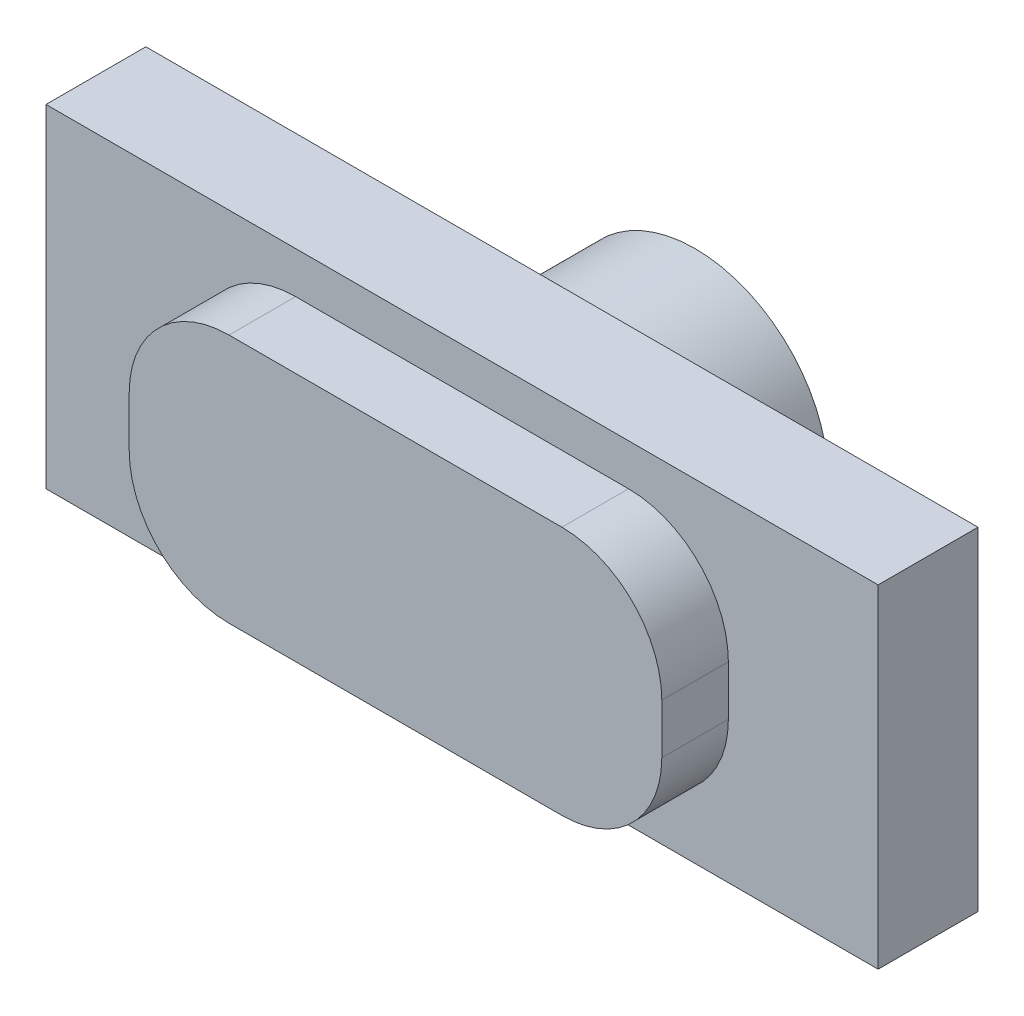
ISO-10303-21;
HEADER;
FILE_DESCRIPTION(('STEP AP214'),'2;1');
FILE_NAME('part.step','',(''),(''),'','','');
FILE_SCHEMA(('AUTOMOTIVE_DESIGN { 1 0 10303 214 1 1 1 1 }'));
ENDSEC;
DATA;
#1=APPLICATION_CONTEXT('core data for automotive mechanical design processes');
#2=APPLICATION_PROTOCOL_DEFINITION('international standard','automotive_design',2000,#1);
#3=PRODUCT_CONTEXT('',#1,'mechanical');
#4=PRODUCT('Part','Part','',(#3));
#5=PRODUCT_RELATED_PRODUCT_CATEGORY('part','',(#4));
#6=PRODUCT_DEFINITION_FORMATION('','',#4);
#7=PRODUCT_DEFINITION_CONTEXT('part definition',#1,'design');
#8=PRODUCT_DEFINITION('design','',#6,#7);
#9=PRODUCT_DEFINITION_SHAPE('','',#8);
#10=(LENGTH_UNIT() NAMED_UNIT(*) SI_UNIT(.MILLI.,.METRE.));
#11=(NAMED_UNIT(*) PLANE_ANGLE_UNIT() SI_UNIT($,.RADIAN.));
#12=(NAMED_UNIT(*) SI_UNIT($,.STERADIAN.) SOLID_ANGLE_UNIT());
#13=UNCERTAINTY_MEASURE_WITH_UNIT(LENGTH_MEASURE(1.E-05),#10,'distance_accuracy_value','');
#14=(GEOMETRIC_REPRESENTATION_CONTEXT(3) GLOBAL_UNCERTAINTY_ASSIGNED_CONTEXT((#13)) GLOBAL_UNIT_ASSIGNED_CONTEXT((#10,
#11,#12)) REPRESENTATION_CONTEXT('',''));
#15=CARTESIAN_POINT('',(0.,0.,0.));
#16=DIRECTION('',(0.,0.,1.));
#17=DIRECTION('',(1.,0.,0.));
#18=AXIS2_PLACEMENT_3D('',#15,#16,#17);
#19=CARTESIAN_POINT('',(0.,0.499999999999999,-4.));
#20=DIRECTION('',(0.,-1.,0.));
#21=DIRECTION('',(1.,0.,0.));
#22=AXIS2_PLACEMENT_3D('',#19,#20,#21);
#23=PLANE('',#22);
#24=DIRECTION('',(0.,0.,-1.));
#25=VECTOR('',#24,1.);
#26=CARTESIAN_POINT('',(-2.55147016443461,0.499999999999999,4.7));
#27=LINE('',#26,#25);
#28=CARTESIAN_POINT('',(-2.55147016443461,0.499999999999999,0.));
#29=VERTEX_POINT('',#28);
#30=CARTESIAN_POINT('',(-2.55147016443461,0.499999999999999,-4.));
#31=VERTEX_POINT('',#30);
#32=EDGE_CURVE('E168',#29,#31,#27,.T.);
#33=ORIENTED_EDGE('',*,*,#32,.F.);
#34=DIRECTION('',(1.,0.,0.));
#35=VECTOR('',#34,1.);
#36=CARTESIAN_POINT('',(0.,0.499999999999999,0.));
#37=LINE('',#36,#35);
#38=CARTESIAN_POINT('',(-3.96862696659689,0.499999999999999,0.));
#39=VERTEX_POINT('',#38);
#40=EDGE_CURVE('E202',#39,#29,#37,.T.);
#41=ORIENTED_EDGE('',*,*,#40,.F.);
#42=DIRECTION('',(0.,0.,1.));
#43=VECTOR('',#42,1.);
#44=CARTESIAN_POINT('',(-3.96862696659689,0.499999999999999,-4.));
#45=LINE('',#44,#43);
#46=CARTESIAN_POINT('',(-3.96862696659689,0.499999999999999,-4.));
#47=VERTEX_POINT('',#46);
#48=EDGE_CURVE('E191',#47,#39,#45,.T.);
#49=ORIENTED_EDGE('',*,*,#48,.F.);
#50=DIRECTION('',(1.,0.,0.));
#51=VECTOR('',#50,1.);
#52=CARTESIAN_POINT('',(0.,0.499999999999999,-4.));
#53=LINE('',#52,#51);
#54=EDGE_CURVE('E186',#47,#31,#53,.T.);
#55=ORIENTED_EDGE('',*,*,#54,.T.);
#56=EDGE_LOOP('',(#33,#41,#49,#55));
#57=FACE_BOUND('',#56,.T.);
#58=ADVANCED_FACE('F33',(#57),#23,.T.);
#59=CARTESIAN_POINT('',(0.,-0.499999999999999,-4.));
#60=DIRECTION('',(0.,-1.,0.));
#61=DIRECTION('',(1.,0.,0.));
#62=AXIS2_PLACEMENT_3D('',#59,#60,#61);
#63=PLANE('',#62);
#64=DIRECTION('',(1.,0.,0.));
#65=VECTOR('',#64,1.);
#66=CARTESIAN_POINT('',(0.,-0.499999999999999,0.));
#67=LINE('',#66,#65);
#68=CARTESIAN_POINT('',(-3.96862696659689,-0.499999999999999,0.));
#69=VERTEX_POINT('',#68);
#70=CARTESIAN_POINT('',(-2.55147016443461,-0.499999999999999,0.));
#71=VERTEX_POINT('',#70);
#72=EDGE_CURVE('E405',#69,#71,#67,.T.);
#73=ORIENTED_EDGE('',*,*,#72,.T.);
#74=DIRECTION('',(0.,0.,-1.));
#75=VECTOR('',#74,1.);
#76=CARTESIAN_POINT('',(-2.55147016443461,-0.499999999999999,4.7));
#77=LINE('',#76,#75);
#78=CARTESIAN_POINT('',(-2.55147016443461,-0.499999999999999,-4.));
#79=VERTEX_POINT('',#78);
#80=EDGE_CURVE('E390',#71,#79,#77,.T.);
#81=ORIENTED_EDGE('',*,*,#80,.T.);
#82=DIRECTION('',(1.,0.,0.));
#83=VECTOR('',#82,1.);
#84=CARTESIAN_POINT('',(0.,-0.499999999999999,-4.));
#85=LINE('',#84,#83);
#86=CARTESIAN_POINT('',(-3.96862696659689,-0.499999999999999,-4.));
#87=VERTEX_POINT('',#86);
#88=EDGE_CURVE('E398',#87,#79,#85,.T.);
#89=ORIENTED_EDGE('',*,*,#88,.F.);
#90=DIRECTION('',(0.,0.,1.));
#91=VECTOR('',#90,1.);
#92=CARTESIAN_POINT('',(-3.96862696659689,-0.499999999999999,-4.));
#93=LINE('',#92,#91);
#94=EDGE_CURVE('E404',#87,#69,#93,.T.);
#95=ORIENTED_EDGE('',*,*,#94,.T.);
#96=EDGE_LOOP('',(#73,#81,#89,#95));
#97=FACE_BOUND('',#96,.T.);
#98=ADVANCED_FACE('F368',(#97),#63,.F.);
#99=CARTESIAN_POINT('',(0.,0.,0.));
#100=DIRECTION('',(0.,0.,1.));
#101=DIRECTION('',(1.,0.,0.));
#102=AXIS2_PLACEMENT_3D('',#99,#100,#101);
#103=PLANE('',#102);
#104=ORIENTED_EDGE('',*,*,#40,.T.);
#105=CARTESIAN_POINT('',(0.,0.,0.));
#106=DIRECTION('',(0.,0.,1.));
#107=DIRECTION('',(1.,0.,0.));
#108=AXIS2_PLACEMENT_3D('',#105,#106,#107);
#109=CIRCLE('',#108,2.6);
#110=EDGE_CURVE('E175',#29,#71,#109,.T.);
#111=ORIENTED_EDGE('',*,*,#110,.T.);
#112=ORIENTED_EDGE('',*,*,#72,.F.);
#113=CARTESIAN_POINT('',(0.,0.,0.));
#114=DIRECTION('',(0.,0.,-1.));
#115=DIRECTION('',(-1.,0.,0.));
#116=AXIS2_PLACEMENT_3D('',#113,#114,#115);
#117=CIRCLE('',#116,4.);
#118=CARTESIAN_POINT('',(3.96862696659689,-0.5,0.));
#119=VERTEX_POINT('',#118);
#120=EDGE_CURVE('E408',#119,#69,#117,.T.);
#121=ORIENTED_EDGE('',*,*,#120,.F.);
#122=CARTESIAN_POINT('',(2.55147016443461,-0.5,0.));
#123=VERTEX_POINT('',#122);
#124=EDGE_CURVE('E54',#123,#119,#67,.T.);
#125=ORIENTED_EDGE('',*,*,#124,.F.);
#126=CARTESIAN_POINT('',(2.55147016443461,0.5,0.));
#127=VERTEX_POINT('',#126);
#128=EDGE_CURVE('E391',#123,#127,#109,.T.);
#129=ORIENTED_EDGE('',*,*,#128,.T.);
#130=CARTESIAN_POINT('',(3.96862696659689,0.5,0.));
#131=VERTEX_POINT('',#130);
#132=EDGE_CURVE('E204',#127,#131,#37,.T.);
#133=ORIENTED_EDGE('',*,*,#132,.T.);
#134=CARTESIAN_POINT('',(0.,0.,0.));
#135=DIRECTION('',(0.,0.,-1.));
#136=DIRECTION('',(-1.,0.,0.));
#137=AXIS2_PLACEMENT_3D('',#134,#135,#136);
#138=CIRCLE('',#137,4.);
#139=EDGE_CURVE('E197',#39,#131,#138,.T.);
#140=ORIENTED_EDGE('',*,*,#139,.F.);
#141=EDGE_LOOP('',(#104,#111,#112,#121,#125,#129,#133,#140));
#142=FACE_BOUND('',#141,.T.);
#143=DIRECTION('',(0.,1.,0.));
#144=VECTOR('',#143,1.);
#145=CARTESIAN_POINT('',(12.5,5.,0.));
#146=LINE('',#145,#144);
#147=CARTESIAN_POINT('',(12.5,-5.,0.));
#148=VERTEX_POINT('',#147);
#149=CARTESIAN_POINT('',(12.5,5.,0.));
#150=VERTEX_POINT('',#149);
#151=EDGE_CURVE('E267',#148,#150,#146,.T.);
#152=ORIENTED_EDGE('',*,*,#151,.F.);
#153=DIRECTION('',(1.,0.,0.));
#154=VECTOR('',#153,1.);
#155=CARTESIAN_POINT('',(-12.5,-5.,0.));
#156=LINE('',#155,#154);
#157=CARTESIAN_POINT('',(-12.5,-5.,0.));
#158=VERTEX_POINT('',#157);
#159=EDGE_CURVE('E272',#158,#148,#156,.T.);
#160=ORIENTED_EDGE('',*,*,#159,.F.);
#161=DIRECTION('',(0.,-1.,0.));
#162=VECTOR('',#161,1.);
#163=CARTESIAN_POINT('',(-12.5,5.,0.));
#164=LINE('',#163,#162);
#165=CARTESIAN_POINT('',(-12.5,5.,0.));
#166=VERTEX_POINT('',#165);
#167=EDGE_CURVE('E283',#166,#158,#164,.T.);
#168=ORIENTED_EDGE('',*,*,#167,.F.);
#169=DIRECTION('',(-1.,0.,0.));
#170=VECTOR('',#169,1.);
#171=CARTESIAN_POINT('',(-12.5,5.,0.));
#172=LINE('',#171,#170);
#173=EDGE_CURVE('E281',#150,#166,#172,.T.);
#174=ORIENTED_EDGE('',*,*,#173,.F.);
#175=EDGE_LOOP('',(#152,#160,#168,#174));
#176=FACE_BOUND('',#175,.T.);
#177=ADVANCED_FACE('F304',(#142,#176),#103,.F.);
#178=CARTESIAN_POINT('',(0.,0.,3.));
#179=DIRECTION('',(0.,0.,1.));
#180=DIRECTION('',(1.,0.,0.));
#181=AXIS2_PLACEMENT_3D('',#178,#179,#180);
#182=PLANE('',#181);
#183=DIRECTION('',(0.,1.,0.));
#184=VECTOR('',#183,1.);
#185=CARTESIAN_POINT('',(12.5,5.,3.));
#186=LINE('',#185,#184);
#187=CARTESIAN_POINT('',(12.5,-5.,3.));
#188=VERTEX_POINT('',#187);
#189=CARTESIAN_POINT('',(12.5,5.,3.));
#190=VERTEX_POINT('',#189);
#191=EDGE_CURVE('E268',#188,#190,#186,.T.);
#192=ORIENTED_EDGE('',*,*,#191,.T.);
#193=DIRECTION('',(-1.,0.,0.));
#194=VECTOR('',#193,1.);
#195=CARTESIAN_POINT('',(-12.5,5.,3.));
#196=LINE('',#195,#194);
#197=CARTESIAN_POINT('',(-12.5,5.,3.));
#198=VERTEX_POINT('',#197);
#199=EDGE_CURVE('E271',#190,#198,#196,.T.);
#200=ORIENTED_EDGE('',*,*,#199,.T.);
#201=DIRECTION('',(0.,-1.,0.));
#202=VECTOR('',#201,1.);
#203=CARTESIAN_POINT('',(-12.5,5.,3.));
#204=LINE('',#203,#202);
#205=CARTESIAN_POINT('',(-12.5,-5.,3.));
#206=VERTEX_POINT('',#205);
#207=EDGE_CURVE('E274',#198,#206,#204,.T.);
#208=ORIENTED_EDGE('',*,*,#207,.T.);
#209=DIRECTION('',(1.,0.,0.));
#210=VECTOR('',#209,1.);
#211=CARTESIAN_POINT('',(-12.5,-5.,3.));
#212=LINE('',#211,#210);
#213=EDGE_CURVE('E276',#206,#188,#212,.T.);
#214=ORIENTED_EDGE('',*,*,#213,.T.);
#215=EDGE_LOOP('',(#192,#200,#208,#214));
#216=FACE_BOUND('',#215,.T.);
#217=DIRECTION('',(0.,1.,0.));
#218=VECTOR('',#217,1.);
#219=CARTESIAN_POINT('',(8.,0.74999999999998,3.));
#220=LINE('',#219,#218);
#221=CARTESIAN_POINT('',(8.,-0.749999999999979,3.));
#222=VERTEX_POINT('',#221);
#223=CARTESIAN_POINT('',(8.,0.749999999999981,3.));
#224=VERTEX_POINT('',#223);
#225=EDGE_CURVE('E232',#222,#224,#220,.T.);
#226=ORIENTED_EDGE('',*,*,#225,.F.);
#227=CARTESIAN_POINT('',(5.,-0.75,3.));
#228=DIRECTION('',(0.,0.,1.));
#229=DIRECTION('',(1.,0.,0.));
#230=AXIS2_PLACEMENT_3D('',#227,#228,#229);
#231=CIRCLE('',#230,3.);
#232=CARTESIAN_POINT('',(4.99999999999998,-3.75,3.));
#233=VERTEX_POINT('',#232);
#234=EDGE_CURVE('E210',#233,#222,#231,.T.);
#235=ORIENTED_EDGE('',*,*,#234,.F.);
#236=DIRECTION('',(1.,0.,0.));
#237=VECTOR('',#236,1.);
#238=CARTESIAN_POINT('',(-4.99999999999998,-3.75,3.));
#239=LINE('',#238,#237);
#240=CARTESIAN_POINT('',(-4.99999999999998,-3.75,3.));
#241=VERTEX_POINT('',#240);
#242=EDGE_CURVE('E215',#241,#233,#239,.T.);
#243=ORIENTED_EDGE('',*,*,#242,.F.);
#244=CARTESIAN_POINT('',(-5.,-0.749999999999999,3.));
#245=DIRECTION('',(0.,0.,1.));
#246=DIRECTION('',(1.,0.,0.));
#247=AXIS2_PLACEMENT_3D('',#244,#245,#246);
#248=CIRCLE('',#247,3.);
#249=CARTESIAN_POINT('',(-8.,-0.749999999999979,3.));
#250=VERTEX_POINT('',#249);
#251=EDGE_CURVE('E242',#250,#241,#248,.T.);
#252=ORIENTED_EDGE('',*,*,#251,.F.);
#253=DIRECTION('',(0.,-1.,0.));
#254=VECTOR('',#253,1.);
#255=CARTESIAN_POINT('',(-8.,0.749999999999979,3.));
#256=LINE('',#255,#254);
#257=CARTESIAN_POINT('',(-8.,0.749999999999979,3.));
#258=VERTEX_POINT('',#257);
#259=EDGE_CURVE('E240',#258,#250,#256,.T.);
#260=ORIENTED_EDGE('',*,*,#259,.F.);
#261=CARTESIAN_POINT('',(-5.,0.75,3.));
#262=DIRECTION('',(0.,0.,1.));
#263=DIRECTION('',(1.,0.,0.));
#264=AXIS2_PLACEMENT_3D('',#261,#262,#263);
#265=CIRCLE('',#264,3.);
#266=CARTESIAN_POINT('',(-4.99999999999998,3.75,3.));
#267=VERTEX_POINT('',#266);
#268=EDGE_CURVE('E238',#267,#258,#265,.T.);
#269=ORIENTED_EDGE('',*,*,#268,.F.);
#270=DIRECTION('',(-1.,0.,0.));
#271=VECTOR('',#270,1.);
#272=CARTESIAN_POINT('',(-4.99999999999998,3.75,3.));
#273=LINE('',#272,#271);
#274=CARTESIAN_POINT('',(4.99999999999998,3.75,3.));
#275=VERTEX_POINT('',#274);
#276=EDGE_CURVE('E236',#275,#267,#273,.T.);
#277=ORIENTED_EDGE('',*,*,#276,.F.);
#278=CARTESIAN_POINT('',(5.,0.750000000000001,3.));
#279=DIRECTION('',(0.,0.,1.));
#280=DIRECTION('',(-1.,0.,0.));
#281=AXIS2_PLACEMENT_3D('',#278,#279,#280);
#282=CIRCLE('',#281,3.);
#283=EDGE_CURVE('E234',#224,#275,#282,.T.);
#284=ORIENTED_EDGE('',*,*,#283,.F.);
#285=EDGE_LOOP('',(#226,#235,#243,#252,#260,#269,#277,#284));
#286=FACE_BOUND('',#285,.T.);
#287=ADVANCED_FACE('F314',(#216,#286),#182,.T.);
#288=CARTESIAN_POINT('',(12.5,5.,3.));
#289=DIRECTION('',(-1.,0.,0.));
#290=DIRECTION('',(0.,0.,1.));
#291=AXIS2_PLACEMENT_3D('',#288,#289,#290);
#292=PLANE('',#291);
#293=ORIENTED_EDGE('',*,*,#151,.T.);
#294=DIRECTION('',(0.,0.,-1.));
#295=VECTOR('',#294,1.);
#296=CARTESIAN_POINT('',(12.5,5.,3.));
#297=LINE('',#296,#295);
#298=EDGE_CURVE('E41',#190,#150,#297,.T.);
#299=ORIENTED_EDGE('',*,*,#298,.F.);
#300=ORIENTED_EDGE('',*,*,#191,.F.);
#301=DIRECTION('',(0.,0.,-1.));
#302=VECTOR('',#301,1.);
#303=CARTESIAN_POINT('',(12.5,-5.,3.));
#304=LINE('',#303,#302);
#305=EDGE_CURVE('E278',#188,#148,#304,.T.);
#306=ORIENTED_EDGE('',*,*,#305,.T.);
#307=EDGE_LOOP('',(#293,#299,#300,#306));
#308=FACE_BOUND('',#307,.T.);
#309=ADVANCED_FACE('F35',(#308),#292,.F.);
#310=CARTESIAN_POINT('',(-12.5,5.,3.));
#311=DIRECTION('',(0.,-1.,0.));
#312=DIRECTION('',(0.,0.,-1.));
#313=AXIS2_PLACEMENT_3D('',#310,#311,#312);
#314=PLANE('',#313);
#315=ORIENTED_EDGE('',*,*,#173,.T.);
#316=DIRECTION('',(0.,0.,-1.));
#317=VECTOR('',#316,1.);
#318=CARTESIAN_POINT('',(-12.5,5.,3.));
#319=LINE('',#318,#317);
#320=EDGE_CURVE('E291',#198,#166,#319,.T.);
#321=ORIENTED_EDGE('',*,*,#320,.F.);
#322=ORIENTED_EDGE('',*,*,#199,.F.);
#323=ORIENTED_EDGE('',*,*,#298,.T.);
#324=EDGE_LOOP('',(#315,#321,#322,#323));
#325=FACE_BOUND('',#324,.T.);
#326=ADVANCED_FACE('F296',(#325),#314,.F.);
#327=CARTESIAN_POINT('',(-12.5,5.,3.));
#328=DIRECTION('',(1.,0.,0.));
#329=DIRECTION('',(0.,0.,-1.));
#330=AXIS2_PLACEMENT_3D('',#327,#328,#329);
#331=PLANE('',#330);
#332=ORIENTED_EDGE('',*,*,#167,.T.);
#333=DIRECTION('',(0.,0.,-1.));
#334=VECTOR('',#333,1.);
#335=CARTESIAN_POINT('',(-12.5,-5.,3.));
#336=LINE('',#335,#334);
#337=EDGE_CURVE('E288',#206,#158,#336,.T.);
#338=ORIENTED_EDGE('',*,*,#337,.F.);
#339=ORIENTED_EDGE('',*,*,#207,.F.);
#340=ORIENTED_EDGE('',*,*,#320,.T.);
#341=EDGE_LOOP('',(#332,#338,#339,#340));
#342=FACE_BOUND('',#341,.T.);
#343=ADVANCED_FACE('F308',(#342),#331,.F.);
#344=CARTESIAN_POINT('',(-12.5,-5.,3.));
#345=DIRECTION('',(0.,1.,0.));
#346=DIRECTION('',(0.,0.,1.));
#347=AXIS2_PLACEMENT_3D('',#344,#345,#346);
#348=PLANE('',#347);
#349=ORIENTED_EDGE('',*,*,#159,.T.);
#350=ORIENTED_EDGE('',*,*,#305,.F.);
#351=ORIENTED_EDGE('',*,*,#213,.F.);
#352=ORIENTED_EDGE('',*,*,#337,.T.);
#353=EDGE_LOOP('',(#349,#350,#351,#352));
#354=FACE_BOUND('',#353,.T.);
#355=ADVANCED_FACE('F312',(#354),#348,.F.);
#356=CARTESIAN_POINT('',(5.,-0.75,5.));
#357=DIRECTION('',(0.,0.,-1.));
#358=DIRECTION('',(-1.,0.,0.));
#359=AXIS2_PLACEMENT_3D('',#356,#357,#358);
#360=CYLINDRICAL_SURFACE('',#359,3.);
#361=ORIENTED_EDGE('',*,*,#234,.T.);
#362=DIRECTION('',(0.,0.,-1.));
#363=VECTOR('',#362,1.);
#364=CARTESIAN_POINT('',(8.,-0.749999999999979,5.));
#365=LINE('',#364,#363);
#366=CARTESIAN_POINT('',(8.,-0.749999999999979,5.));
#367=VERTEX_POINT('',#366);
#368=EDGE_CURVE('E265',#367,#222,#365,.T.);
#369=ORIENTED_EDGE('',*,*,#368,.F.);
#370=CARTESIAN_POINT('',(5.,-0.75,5.));
#371=DIRECTION('',(0.,0.,1.));
#372=DIRECTION('',(1.,0.,0.));
#373=AXIS2_PLACEMENT_3D('',#370,#371,#372);
#374=CIRCLE('',#373,3.);
#375=CARTESIAN_POINT('',(4.99999999999998,-3.75,5.));
#376=VERTEX_POINT('',#375);
#377=EDGE_CURVE('E211',#376,#367,#374,.T.);
#378=ORIENTED_EDGE('',*,*,#377,.F.);
#379=DIRECTION('',(0.,0.,-1.));
#380=VECTOR('',#379,1.);
#381=CARTESIAN_POINT('',(4.99999999999998,-3.75,5.));
#382=LINE('',#381,#380);
#383=EDGE_CURVE('E229',#376,#233,#382,.T.);
#384=ORIENTED_EDGE('',*,*,#383,.T.);
#385=EDGE_LOOP('',(#361,#369,#378,#384));
#386=FACE_BOUND('',#385,.T.);
#387=ADVANCED_FACE('F339',(#386),#360,.T.);
#388=CARTESIAN_POINT('',(8.,0.74999999999998,5.));
#389=DIRECTION('',(-1.,0.,0.));
#390=DIRECTION('',(0.,0.,1.));
#391=AXIS2_PLACEMENT_3D('',#388,#389,#390);
#392=PLANE('',#391);
#393=ORIENTED_EDGE('',*,*,#225,.T.);
#394=DIRECTION('',(0.,0.,-1.));
#395=VECTOR('',#394,1.);
#396=CARTESIAN_POINT('',(8.,0.749999999999981,5.));
#397=LINE('',#396,#395);
#398=CARTESIAN_POINT('',(8.,0.749999999999981,5.));
#399=VERTEX_POINT('',#398);
#400=EDGE_CURVE('E262',#399,#224,#397,.T.);
#401=ORIENTED_EDGE('',*,*,#400,.F.);
#402=DIRECTION('',(0.,1.,0.));
#403=VECTOR('',#402,1.);
#404=CARTESIAN_POINT('',(8.,0.74999999999998,5.));
#405=LINE('',#404,#403);
#406=EDGE_CURVE('E214',#367,#399,#405,.T.);
#407=ORIENTED_EDGE('',*,*,#406,.F.);
#408=ORIENTED_EDGE('',*,*,#368,.T.);
#409=EDGE_LOOP('',(#393,#401,#407,#408));
#410=FACE_BOUND('',#409,.T.);
#411=ADVANCED_FACE('F325',(#410),#392,.F.);
#412=CARTESIAN_POINT('',(5.,0.750000000000001,5.));
#413=DIRECTION('',(0.,0.,-1.));
#414=DIRECTION('',(-1.,0.,0.));
#415=AXIS2_PLACEMENT_3D('',#412,#413,#414);
#416=CYLINDRICAL_SURFACE('',#415,3.);
#417=ORIENTED_EDGE('',*,*,#283,.T.);
#418=DIRECTION('',(0.,0.,-1.));
#419=VECTOR('',#418,1.);
#420=CARTESIAN_POINT('',(4.99999999999998,3.75,5.));
#421=LINE('',#420,#419);
#422=CARTESIAN_POINT('',(4.99999999999998,3.75,5.));
#423=VERTEX_POINT('',#422);
#424=EDGE_CURVE('E259',#423,#275,#421,.T.);
#425=ORIENTED_EDGE('',*,*,#424,.F.);
#426=CARTESIAN_POINT('',(5.,0.750000000000001,5.));
#427=DIRECTION('',(0.,0.,1.));
#428=DIRECTION('',(-1.,0.,0.));
#429=AXIS2_PLACEMENT_3D('',#426,#427,#428);
#430=CIRCLE('',#429,3.);
#431=EDGE_CURVE('E217',#399,#423,#430,.T.);
#432=ORIENTED_EDGE('',*,*,#431,.F.);
#433=ORIENTED_EDGE('',*,*,#400,.T.);
#434=EDGE_LOOP('',(#417,#425,#432,#433));
#435=FACE_BOUND('',#434,.T.);
#436=ADVANCED_FACE('F329',(#435),#416,.T.);
#437=CARTESIAN_POINT('',(-4.99999999999998,3.75,5.));
#438=DIRECTION('',(0.,-1.,0.));
#439=DIRECTION('',(0.,0.,-1.));
#440=AXIS2_PLACEMENT_3D('',#437,#438,#439);
#441=PLANE('',#440);
#442=ORIENTED_EDGE('',*,*,#276,.T.);
#443=DIRECTION('',(0.,0.,-1.));
#444=VECTOR('',#443,1.);
#445=CARTESIAN_POINT('',(-4.99999999999998,3.75,5.));
#446=LINE('',#445,#444);
#447=CARTESIAN_POINT('',(-4.99999999999998,3.75,5.));
#448=VERTEX_POINT('',#447);
#449=EDGE_CURVE('E256',#448,#267,#446,.T.);
#450=ORIENTED_EDGE('',*,*,#449,.F.);
#451=DIRECTION('',(-1.,0.,0.));
#452=VECTOR('',#451,1.);
#453=CARTESIAN_POINT('',(-4.99999999999998,3.75,5.));
#454=LINE('',#453,#452);
#455=EDGE_CURVE('E219',#423,#448,#454,.T.);
#456=ORIENTED_EDGE('',*,*,#455,.F.);
#457=ORIENTED_EDGE('',*,*,#424,.T.);
#458=EDGE_LOOP('',(#442,#450,#456,#457));
#459=FACE_BOUND('',#458,.T.);
#460=ADVANCED_FACE('F358',(#459),#441,.F.);
#461=CARTESIAN_POINT('',(-5.,0.75,5.));
#462=DIRECTION('',(0.,0.,-1.));
#463=DIRECTION('',(-1.,0.,0.));
#464=AXIS2_PLACEMENT_3D('',#461,#462,#463);
#465=CYLINDRICAL_SURFACE('',#464,3.);
#466=ORIENTED_EDGE('',*,*,#268,.T.);
#467=DIRECTION('',(0.,0.,-1.));
#468=VECTOR('',#467,1.);
#469=CARTESIAN_POINT('',(-8.,0.749999999999979,5.));
#470=LINE('',#469,#468);
#471=CARTESIAN_POINT('',(-8.,0.749999999999979,5.));
#472=VERTEX_POINT('',#471);
#473=EDGE_CURVE('E253',#472,#258,#470,.T.);
#474=ORIENTED_EDGE('',*,*,#473,.F.);
#475=CARTESIAN_POINT('',(-5.,0.75,5.));
#476=DIRECTION('',(0.,0.,1.));
#477=DIRECTION('',(1.,0.,0.));
#478=AXIS2_PLACEMENT_3D('',#475,#476,#477);
#479=CIRCLE('',#478,3.);
#480=EDGE_CURVE('E221',#448,#472,#479,.T.);
#481=ORIENTED_EDGE('',*,*,#480,.F.);
#482=ORIENTED_EDGE('',*,*,#449,.T.);
#483=EDGE_LOOP('',(#466,#474,#481,#482));
#484=FACE_BOUND('',#483,.T.);
#485=ADVANCED_FACE('F356',(#484),#465,.T.);
#486=CARTESIAN_POINT('',(-8.,0.749999999999979,5.));
#487=DIRECTION('',(1.,0.,0.));
#488=DIRECTION('',(0.,0.,-1.));
#489=AXIS2_PLACEMENT_3D('',#486,#487,#488);
#490=PLANE('',#489);
#491=ORIENTED_EDGE('',*,*,#259,.T.);
#492=DIRECTION('',(0.,0.,-1.));
#493=VECTOR('',#492,1.);
#494=CARTESIAN_POINT('',(-8.,-0.749999999999979,5.));
#495=LINE('',#494,#493);
#496=CARTESIAN_POINT('',(-8.,-0.749999999999979,5.));
#497=VERTEX_POINT('',#496);
#498=EDGE_CURVE('E250',#497,#250,#495,.T.);
#499=ORIENTED_EDGE('',*,*,#498,.F.);
#500=DIRECTION('',(0.,-1.,0.));
#501=VECTOR('',#500,1.);
#502=CARTESIAN_POINT('',(-8.,0.749999999999979,5.));
#503=LINE('',#502,#501);
#504=EDGE_CURVE('E223',#472,#497,#503,.T.);
#505=ORIENTED_EDGE('',*,*,#504,.F.);
#506=ORIENTED_EDGE('',*,*,#473,.T.);
#507=EDGE_LOOP('',(#491,#499,#505,#506));
#508=FACE_BOUND('',#507,.T.);
#509=ADVANCED_FACE('F352',(#508),#490,.F.);
#510=CARTESIAN_POINT('',(-5.,-0.749999999999999,5.));
#511=DIRECTION('',(0.,0.,-1.));
#512=DIRECTION('',(-1.,0.,0.));
#513=AXIS2_PLACEMENT_3D('',#510,#511,#512);
#514=CYLINDRICAL_SURFACE('',#513,3.);
#515=ORIENTED_EDGE('',*,*,#251,.T.);
#516=DIRECTION('',(0.,0.,-1.));
#517=VECTOR('',#516,1.);
#518=CARTESIAN_POINT('',(-4.99999999999998,-3.75,5.));
#519=LINE('',#518,#517);
#520=CARTESIAN_POINT('',(-4.99999999999998,-3.75,5.));
#521=VERTEX_POINT('',#520);
#522=EDGE_CURVE('E248',#521,#241,#519,.T.);
#523=ORIENTED_EDGE('',*,*,#522,.F.);
#524=CARTESIAN_POINT('',(-5.,-0.749999999999999,5.));
#525=DIRECTION('',(0.,0.,1.));
#526=DIRECTION('',(1.,0.,0.));
#527=AXIS2_PLACEMENT_3D('',#524,#525,#526);
#528=CIRCLE('',#527,3.);
#529=EDGE_CURVE('E225',#497,#521,#528,.T.);
#530=ORIENTED_EDGE('',*,*,#529,.F.);
#531=ORIENTED_EDGE('',*,*,#498,.T.);
#532=EDGE_LOOP('',(#515,#523,#530,#531));
#533=FACE_BOUND('',#532,.T.);
#534=ADVANCED_FACE('F347',(#533),#514,.T.);
#535=CARTESIAN_POINT('',(-4.99999999999998,-3.75,5.));
#536=DIRECTION('',(0.,1.,0.));
#537=DIRECTION('',(0.,0.,1.));
#538=AXIS2_PLACEMENT_3D('',#535,#536,#537);
#539=PLANE('',#538);
#540=ORIENTED_EDGE('',*,*,#242,.T.);
#541=ORIENTED_EDGE('',*,*,#383,.F.);
#542=DIRECTION('',(1.,0.,0.));
#543=VECTOR('',#542,1.);
#544=CARTESIAN_POINT('',(-4.99999999999998,-3.75,5.));
#545=LINE('',#544,#543);
#546=EDGE_CURVE('E227',#521,#376,#545,.T.);
#547=ORIENTED_EDGE('',*,*,#546,.F.);
#548=ORIENTED_EDGE('',*,*,#522,.T.);
#549=EDGE_LOOP('',(#540,#541,#547,#548));
#550=FACE_BOUND('',#549,.T.);
#551=ADVANCED_FACE('F341',(#550),#539,.F.);
#552=CARTESIAN_POINT('',(5.,-0.75,5.));
#553=DIRECTION('',(0.,0.,1.));
#554=DIRECTION('',(1.,0.,0.));
#555=AXIS2_PLACEMENT_3D('',#552,#553,#554);
#556=PLANE('',#555);
#557=ORIENTED_EDGE('',*,*,#377,.T.);
#558=ORIENTED_EDGE('',*,*,#406,.T.);
#559=ORIENTED_EDGE('',*,*,#431,.T.);
#560=ORIENTED_EDGE('',*,*,#455,.T.);
#561=ORIENTED_EDGE('',*,*,#480,.T.);
#562=ORIENTED_EDGE('',*,*,#504,.T.);
#563=ORIENTED_EDGE('',*,*,#529,.T.);
#564=ORIENTED_EDGE('',*,*,#546,.T.);
#565=EDGE_LOOP('',(#557,#558,#559,#560,#561,#562,#563,#564));
#566=FACE_BOUND('',#565,.T.);
#567=ADVANCED_FACE('F333',(#566),#556,.T.);
#568=DIRECTION('',(0.,0.,-1.));
#569=VECTOR('',#568,1.);
#570=CARTESIAN_POINT('',(2.55147016443461,0.5,4.7));
#571=LINE('',#570,#569);
#572=CARTESIAN_POINT('',(2.55147016443461,0.5,-4.));
#573=VERTEX_POINT('',#572);
#574=EDGE_CURVE('E388',#573,#127,#571,.F.);
#575=ORIENTED_EDGE('',*,*,#574,.F.);
#576=CARTESIAN_POINT('',(3.96862696659689,0.5,-4.));
#577=VERTEX_POINT('',#576);
#578=EDGE_CURVE('E187',#573,#577,#53,.T.);
#579=ORIENTED_EDGE('',*,*,#578,.T.);
#580=DIRECTION('',(0.,0.,1.));
#581=VECTOR('',#580,1.);
#582=CARTESIAN_POINT('',(3.96862696659689,0.5,-4.));
#583=LINE('',#582,#581);
#584=EDGE_CURVE('E195',#577,#131,#583,.T.);
#585=ORIENTED_EDGE('',*,*,#584,.T.);
#586=ORIENTED_EDGE('',*,*,#132,.F.);
#587=EDGE_LOOP('',(#575,#579,#585,#586));
#588=FACE_BOUND('',#587,.T.);
#589=ADVANCED_FACE('F370',(#588),#23,.T.);
#590=CARTESIAN_POINT('',(0.,0.,-4.));
#591=DIRECTION('',(0.,0.,1.));
#592=DIRECTION('',(1.,0.,0.));
#593=AXIS2_PLACEMENT_3D('',#590,#591,#592);
#594=CYLINDRICAL_SURFACE('',#593,4.);
#595=ORIENTED_EDGE('',*,*,#139,.T.);
#596=ORIENTED_EDGE('',*,*,#584,.F.);
#597=CARTESIAN_POINT('',(0.,0.,-4.));
#598=DIRECTION('',(0.,0.,-1.));
#599=DIRECTION('',(-1.,0.,0.));
#600=AXIS2_PLACEMENT_3D('',#597,#598,#599);
#601=CIRCLE('',#600,4.);
#602=EDGE_CURVE('E193',#47,#577,#601,.T.);
#603=ORIENTED_EDGE('',*,*,#602,.F.);
#604=ORIENTED_EDGE('',*,*,#48,.T.);
#605=EDGE_LOOP('',(#595,#596,#603,#604));
#606=FACE_BOUND('',#605,.T.);
#607=ADVANCED_FACE('F380',(#606),#594,.T.);
#608=CARTESIAN_POINT('',(0.,0.,-4.));
#609=DIRECTION('',(0.,0.,-1.));
#610=DIRECTION('',(-1.,0.,0.));
#611=AXIS2_PLACEMENT_3D('',#608,#609,#610);
#612=PLANE('',#611);
#613=CARTESIAN_POINT('',(0.,0.,-4.));
#614=DIRECTION('',(0.,0.,-1.));
#615=DIRECTION('',(-1.,0.,0.));
#616=AXIS2_PLACEMENT_3D('',#613,#614,#615);
#617=CIRCLE('',#616,2.6);
#618=EDGE_CURVE('E172',#31,#573,#617,.T.);
#619=ORIENTED_EDGE('',*,*,#618,.F.);
#620=ORIENTED_EDGE('',*,*,#54,.F.);
#621=ORIENTED_EDGE('',*,*,#602,.T.);
#622=ORIENTED_EDGE('',*,*,#578,.F.);
#623=EDGE_LOOP('',(#619,#620,#621,#622));
#624=FACE_BOUND('',#623,.T.);
#625=ADVANCED_FACE('F184',(#624),#612,.T.);
#626=CARTESIAN_POINT('',(2.55147016443461,-0.5,-4.));
#627=VERTEX_POINT('',#626);
#628=CARTESIAN_POINT('',(3.96862696659689,-0.5,-4.));
#629=VERTEX_POINT('',#628);
#630=EDGE_CURVE('E402',#627,#629,#85,.T.);
#631=ORIENTED_EDGE('',*,*,#630,.F.);
#632=DIRECTION('',(0.,0.,-1.));
#633=VECTOR('',#632,1.);
#634=CARTESIAN_POINT('',(2.55147016443461,-0.5,4.7));
#635=LINE('',#634,#633);
#636=EDGE_CURVE('E47',#627,#123,#635,.F.);
#637=ORIENTED_EDGE('',*,*,#636,.T.);
#638=ORIENTED_EDGE('',*,*,#124,.T.);
#639=DIRECTION('',(0.,0.,1.));
#640=VECTOR('',#639,1.);
#641=CARTESIAN_POINT('',(3.96862696659689,-0.5,-4.));
#642=LINE('',#641,#640);
#643=EDGE_CURVE('E199',#629,#119,#642,.T.);
#644=ORIENTED_EDGE('',*,*,#643,.F.);
#645=EDGE_LOOP('',(#631,#637,#638,#644));
#646=FACE_BOUND('',#645,.T.);
#647=ADVANCED_FACE('F376',(#646),#63,.F.);
#648=CARTESIAN_POINT('',(0.,0.,-4.));
#649=DIRECTION('',(0.,0.,1.));
#650=DIRECTION('',(1.,0.,0.));
#651=AXIS2_PLACEMENT_3D('',#648,#649,#650);
#652=CYLINDRICAL_SURFACE('',#651,4.);
#653=ORIENTED_EDGE('',*,*,#120,.T.);
#654=ORIENTED_EDGE('',*,*,#94,.F.);
#655=CARTESIAN_POINT('',(0.,0.,-4.));
#656=DIRECTION('',(0.,0.,-1.));
#657=DIRECTION('',(-1.,0.,0.));
#658=AXIS2_PLACEMENT_3D('',#655,#656,#657);
#659=CIRCLE('',#658,4.);
#660=EDGE_CURVE('E401',#629,#87,#659,.T.);
#661=ORIENTED_EDGE('',*,*,#660,.F.);
#662=ORIENTED_EDGE('',*,*,#643,.T.);
#663=EDGE_LOOP('',(#653,#654,#661,#662));
#664=FACE_BOUND('',#663,.T.);
#665=ADVANCED_FACE('F421',(#664),#652,.T.);
#666=CARTESIAN_POINT('',(0.,0.,-4.));
#667=DIRECTION('',(0.,0.,-1.));
#668=DIRECTION('',(-1.,0.,0.));
#669=AXIS2_PLACEMENT_3D('',#666,#667,#668);
#670=PLANE('',#669);
#671=CARTESIAN_POINT('',(0.,0.,-4.));
#672=DIRECTION('',(0.,0.,-1.));
#673=DIRECTION('',(-1.,0.,0.));
#674=AXIS2_PLACEMENT_3D('',#671,#672,#673);
#675=CIRCLE('',#674,2.6);
#676=EDGE_CURVE('E11',#627,#79,#675,.T.);
#677=ORIENTED_EDGE('',*,*,#676,.F.);
#678=ORIENTED_EDGE('',*,*,#630,.T.);
#679=ORIENTED_EDGE('',*,*,#660,.T.);
#680=ORIENTED_EDGE('',*,*,#88,.T.);
#681=EDGE_LOOP('',(#677,#678,#679,#680));
#682=FACE_BOUND('',#681,.T.);
#683=ADVANCED_FACE('F419',(#682),#670,.T.);
#684=CARTESIAN_POINT('',(0.,0.,4.7));
#685=DIRECTION('',(0.,0.,-1.));
#686=DIRECTION('',(-1.,0.,0.));
#687=AXIS2_PLACEMENT_3D('',#684,#685,#686);
#688=CYLINDRICAL_SURFACE('',#687,2.6);
#689=ORIENTED_EDGE('',*,*,#32,.T.);
#690=ORIENTED_EDGE('',*,*,#618,.T.);
#691=ORIENTED_EDGE('',*,*,#574,.T.);
#692=ORIENTED_EDGE('',*,*,#128,.F.);
#693=ORIENTED_EDGE('',*,*,#636,.F.);
#694=ORIENTED_EDGE('',*,*,#676,.T.);
#695=ORIENTED_EDGE('',*,*,#80,.F.);
#696=ORIENTED_EDGE('',*,*,#110,.F.);
#697=EDGE_LOOP('',(#689,#690,#691,#692,#693,#694,#695,#696));
#698=FACE_BOUND('',#697,.T.);
#699=CARTESIAN_POINT('',(0.,0.,4.7));
#700=DIRECTION('',(0.,0.,-1.));
#701=DIRECTION('',(-1.,0.,0.));
#702=AXIS2_PLACEMENT_3D('',#699,#700,#701);
#703=CIRCLE('',#702,2.6);
#704=CARTESIAN_POINT('',(-2.6,0.,4.7));
#705=VERTEX_POINT('',#704);
#706=EDGE_CURVE('E188',#705,#705,#703,.T.);
#707=ORIENTED_EDGE('',*,*,#706,.F.);
#708=EDGE_LOOP('',(#707));
#709=FACE_BOUND('',#708,.T.);
#710=ADVANCED_FACE('F170',(#698,#709),#688,.F.);
#711=CARTESIAN_POINT('',(0.,0.,4.7));
#712=DIRECTION('',(0.,0.,-1.));
#713=DIRECTION('',(-1.,0.,0.));
#714=AXIS2_PLACEMENT_3D('',#711,#712,#713);
#715=PLANE('',#714);
#716=ORIENTED_EDGE('',*,*,#706,.T.);
#717=EDGE_LOOP('',(#716));
#718=FACE_BOUND('',#717,.T.);
#719=ADVANCED_FACE('F457',(#718),#715,.T.);
#720=CLOSED_SHELL('',(#58,#98,#177,#287,#309,#326,#343,#355,#387,#411,#436,#460,#485,#509,#534,
#551,#567,#589,#607,#625,#647,#665,#683,#710,#719));
#721=MANIFOLD_SOLID_BREP('B2',#720);
#722=ADVANCED_BREP_SHAPE_REPRESENTATION('',(#18,#721),#14);
#723=SHAPE_DEFINITION_REPRESENTATION(#9,#722);
ENDSEC;
END-ISO-10303-21;
